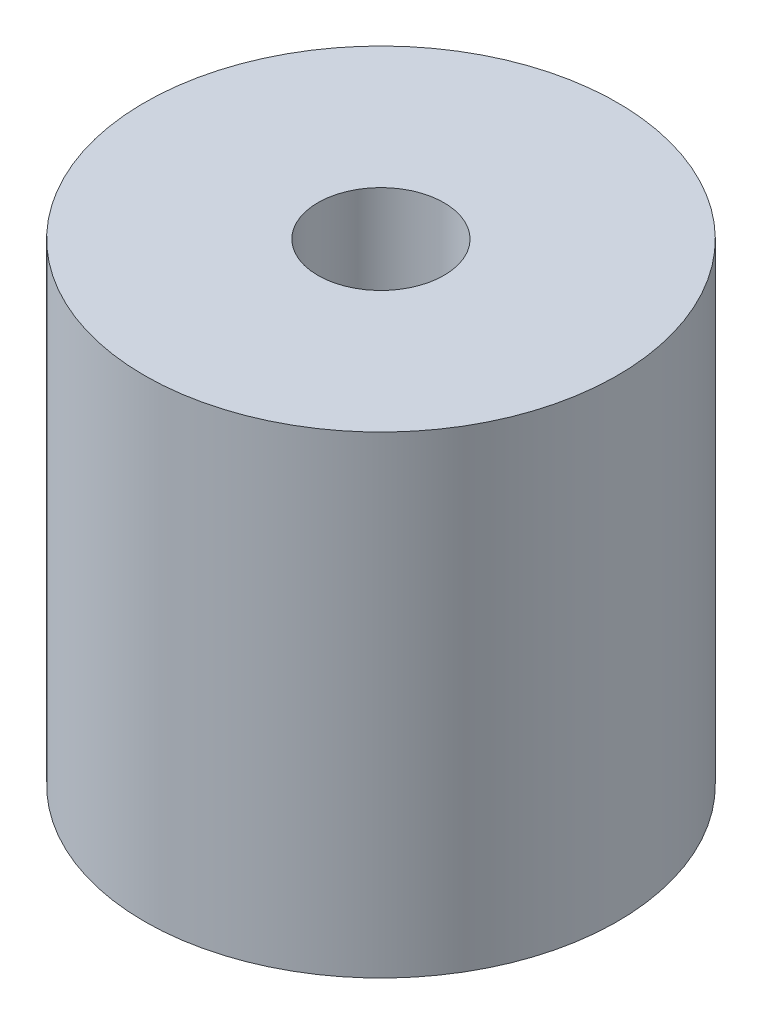
ISO-10303-21;
HEADER;
FILE_DESCRIPTION(('STEP AP214'),'2;1');
FILE_NAME('part.step','',(''),(''),'','','');
FILE_SCHEMA(('AUTOMOTIVE_DESIGN { 1 0 10303 214 1 1 1 1 }'));
ENDSEC;
DATA;
#1=APPLICATION_CONTEXT('core data for automotive mechanical design processes');
#2=APPLICATION_PROTOCOL_DEFINITION('international standard','automotive_design',2000,#1);
#3=PRODUCT_CONTEXT('',#1,'mechanical');
#4=PRODUCT('Part','Part','',(#3));
#5=PRODUCT_RELATED_PRODUCT_CATEGORY('part','',(#4));
#6=PRODUCT_DEFINITION_FORMATION('','',#4);
#7=PRODUCT_DEFINITION_CONTEXT('part definition',#1,'design');
#8=PRODUCT_DEFINITION('design','',#6,#7);
#9=PRODUCT_DEFINITION_SHAPE('','',#8);
#10=(LENGTH_UNIT() NAMED_UNIT(*) SI_UNIT(.MILLI.,.METRE.));
#11=(NAMED_UNIT(*) PLANE_ANGLE_UNIT() SI_UNIT($,.RADIAN.));
#12=(NAMED_UNIT(*) SI_UNIT($,.STERADIAN.) SOLID_ANGLE_UNIT());
#13=UNCERTAINTY_MEASURE_WITH_UNIT(LENGTH_MEASURE(1.E-05),#10,'distance_accuracy_value','');
#14=(GEOMETRIC_REPRESENTATION_CONTEXT(3) GLOBAL_UNCERTAINTY_ASSIGNED_CONTEXT((#13)) GLOBAL_UNIT_ASSIGNED_CONTEXT((#10,
#11,#12)) REPRESENTATION_CONTEXT('',''));
#15=CARTESIAN_POINT('',(0.,0.,0.));
#16=DIRECTION('',(0.,0.,1.));
#17=DIRECTION('',(1.,0.,0.));
#18=AXIS2_PLACEMENT_3D('',#15,#16,#17);
#19=CARTESIAN_POINT('',(0.,30.,0.));
#20=DIRECTION('',(0.,-1.,0.));
#21=DIRECTION('',(0.,0.,-1.));
#22=AXIS2_PLACEMENT_3D('',#19,#20,#21);
#23=CYLINDRICAL_SURFACE('',#22,15.);
#24=CARTESIAN_POINT('',(0.,30.,0.));
#25=DIRECTION('',(0.,1.,0.));
#26=DIRECTION('',(0.,0.,1.));
#27=AXIS2_PLACEMENT_3D('',#24,#25,#26);
#28=CIRCLE('',#27,15.);
#29=CARTESIAN_POINT('',(0.,30.,15.));
#30=VERTEX_POINT('',#29);
#31=EDGE_CURVE('E10',#30,#30,#28,.T.);
#32=ORIENTED_EDGE('',*,*,#31,.F.);
#33=EDGE_LOOP('',(#32));
#34=FACE_BOUND('',#33,.T.);
#35=CARTESIAN_POINT('',(0.,0.,0.));
#36=DIRECTION('',(0.,1.,0.));
#37=DIRECTION('',(0.,0.,1.));
#38=AXIS2_PLACEMENT_3D('',#35,#36,#37);
#39=CIRCLE('',#38,15.);
#40=CARTESIAN_POINT('',(0.,0.,15.));
#41=VERTEX_POINT('',#40);
#42=EDGE_CURVE('E37',#41,#41,#39,.T.);
#43=ORIENTED_EDGE('',*,*,#42,.T.);
#44=EDGE_LOOP('',(#43));
#45=FACE_BOUND('',#44,.T.);
#46=ADVANCED_FACE('F34',(#34,#45),#23,.T.);
#47=CARTESIAN_POINT('',(0.,30.,0.));
#48=DIRECTION('',(0.,1.,0.));
#49=DIRECTION('',(0.,0.,1.));
#50=AXIS2_PLACEMENT_3D('',#47,#48,#49);
#51=PLANE('',#50);
#52=CARTESIAN_POINT('',(0.,30.,0.));
#53=DIRECTION('',(0.,1.,0.));
#54=DIRECTION('',(0.,0.,1.));
#55=AXIS2_PLACEMENT_3D('',#52,#53,#54);
#56=CIRCLE('',#55,4.);
#57=CARTESIAN_POINT('',(0.,30.,4.));
#58=VERTEX_POINT('',#57);
#59=EDGE_CURVE('E48',#58,#58,#56,.T.);
#60=ORIENTED_EDGE('',*,*,#59,.F.);
#61=EDGE_LOOP('',(#60));
#62=FACE_BOUND('',#61,.T.);
#63=ORIENTED_EDGE('',*,*,#31,.T.);
#64=EDGE_LOOP('',(#63));
#65=FACE_BOUND('',#64,.T.);
#66=ADVANCED_FACE('F55',(#62,#65),#51,.T.);
#67=CARTESIAN_POINT('',(0.,0.,0.));
#68=DIRECTION('',(0.,1.,0.));
#69=DIRECTION('',(0.,0.,1.));
#70=AXIS2_PLACEMENT_3D('',#67,#68,#69);
#71=PLANE('',#70);
#72=CARTESIAN_POINT('',(0.,0.,0.));
#73=DIRECTION('',(0.,1.,0.));
#74=DIRECTION('',(0.,0.,1.));
#75=AXIS2_PLACEMENT_3D('',#72,#73,#74);
#76=CIRCLE('',#75,4.);
#77=CARTESIAN_POINT('',(0.,0.,4.));
#78=VERTEX_POINT('',#77);
#79=EDGE_CURVE('E44',#78,#78,#76,.F.);
#80=ORIENTED_EDGE('',*,*,#79,.F.);
#81=EDGE_LOOP('',(#80));
#82=FACE_BOUND('',#81,.T.);
#83=ORIENTED_EDGE('',*,*,#42,.F.);
#84=EDGE_LOOP('',(#83));
#85=FACE_BOUND('',#84,.T.);
#86=ADVANCED_FACE('F57',(#82,#85),#71,.F.);
#87=CARTESIAN_POINT('',(0.,-0.001000000000001,0.));
#88=DIRECTION('',(0.,1.,0.));
#89=DIRECTION('',(0.,0.,1.));
#90=AXIS2_PLACEMENT_3D('',#87,#88,#89);
#91=CYLINDRICAL_SURFACE('',#90,4.);
#92=ORIENTED_EDGE('',*,*,#59,.T.);
#93=EDGE_LOOP('',(#92));
#94=FACE_BOUND('',#93,.T.);
#95=ORIENTED_EDGE('',*,*,#79,.T.);
#96=EDGE_LOOP('',(#95));
#97=FACE_BOUND('',#96,.T.);
#98=ADVANCED_FACE('F52',(#94,#97),#91,.F.);
#99=CLOSED_SHELL('',(#46,#66,#86,#98));
#100=MANIFOLD_SOLID_BREP('B2',#99);
#101=ADVANCED_BREP_SHAPE_REPRESENTATION('',(#18,#100),#14);
#102=SHAPE_DEFINITION_REPRESENTATION(#9,#101);
ENDSEC;
END-ISO-10303-21;
